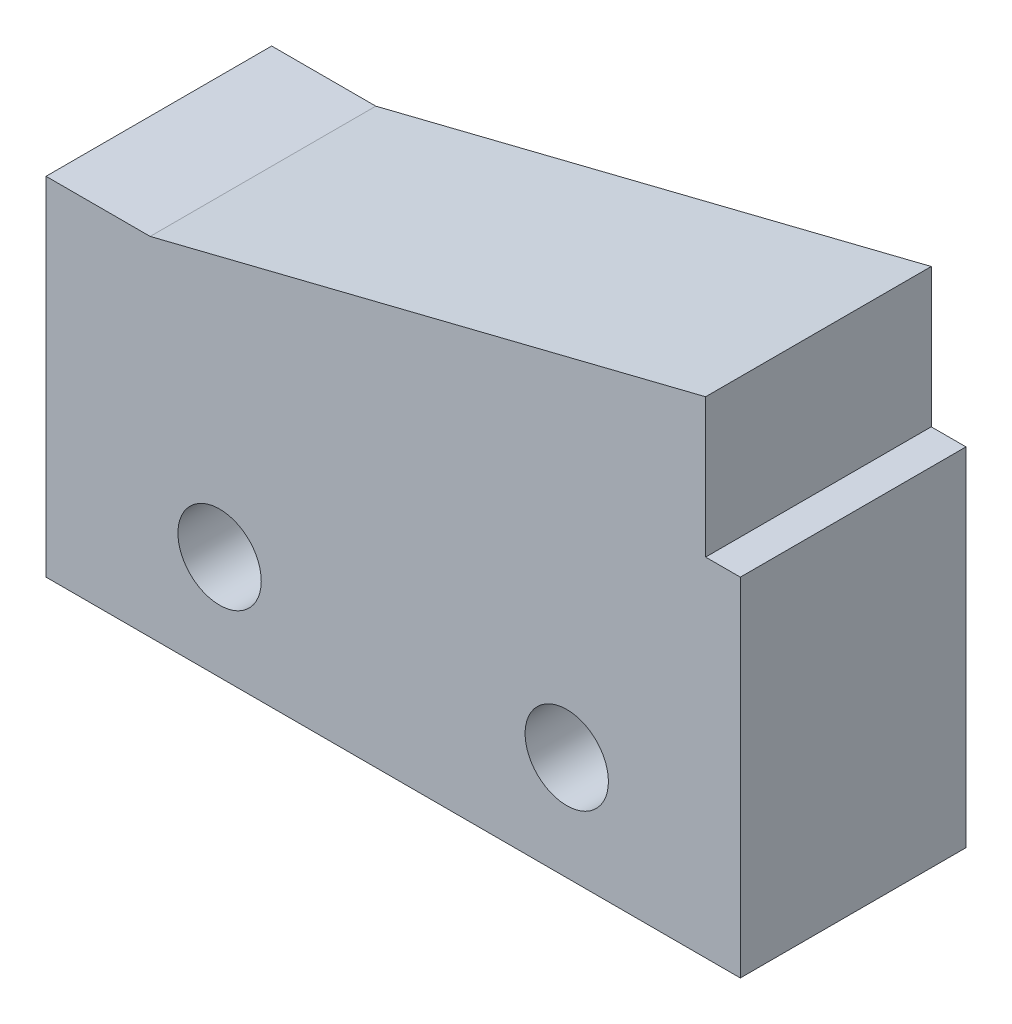
ISO-10303-21;
HEADER;
FILE_DESCRIPTION(('STEP AP214'),'2;1');
FILE_NAME('part.step','',(''),(''),'','','');
FILE_SCHEMA(('AUTOMOTIVE_DESIGN { 1 0 10303 214 1 1 1 1 }'));
ENDSEC;
DATA;
#1=APPLICATION_CONTEXT('core data for automotive mechanical design processes');
#2=APPLICATION_PROTOCOL_DEFINITION('international standard','automotive_design',2000,#1);
#3=PRODUCT_CONTEXT('',#1,'mechanical');
#4=PRODUCT('Part','Part','',(#3));
#5=PRODUCT_RELATED_PRODUCT_CATEGORY('part','',(#4));
#6=PRODUCT_DEFINITION_FORMATION('','',#4);
#7=PRODUCT_DEFINITION_CONTEXT('part definition',#1,'design');
#8=PRODUCT_DEFINITION('design','',#6,#7);
#9=PRODUCT_DEFINITION_SHAPE('','',#8);
#10=(LENGTH_UNIT() NAMED_UNIT(*) SI_UNIT(.MILLI.,.METRE.));
#11=(NAMED_UNIT(*) PLANE_ANGLE_UNIT() SI_UNIT($,.RADIAN.));
#12=(NAMED_UNIT(*) SI_UNIT($,.STERADIAN.) SOLID_ANGLE_UNIT());
#13=UNCERTAINTY_MEASURE_WITH_UNIT(LENGTH_MEASURE(1.E-05),#10,'distance_accuracy_value','');
#14=(GEOMETRIC_REPRESENTATION_CONTEXT(3) GLOBAL_UNCERTAINTY_ASSIGNED_CONTEXT((#13)) GLOBAL_UNIT_ASSIGNED_CONTEXT((#10,
#11,#12)) REPRESENTATION_CONTEXT('',''));
#15=CARTESIAN_POINT('',(0.,0.,0.));
#16=DIRECTION('',(0.,0.,1.));
#17=DIRECTION('',(1.,0.,0.));
#18=AXIS2_PLACEMENT_3D('',#15,#16,#17);
#19=CARTESIAN_POINT('',(19.,0.,6.5));
#20=DIRECTION('',(1.,0.,0.));
#21=DIRECTION('',(0.,0.,-1.));
#22=AXIS2_PLACEMENT_3D('',#19,#20,#21);
#23=PLANE('',#22);
#24=DIRECTION('',(0.,-1.,0.));
#25=VECTOR('',#24,1.);
#26=CARTESIAN_POINT('',(19.,0.,0.));
#27=LINE('',#26,#25);
#28=CARTESIAN_POINT('',(19.,14.,0.));
#29=VERTEX_POINT('',#28);
#30=CARTESIAN_POINT('',(19.,10.,0.));
#31=VERTEX_POINT('',#30);
#32=EDGE_CURVE('E122',#29,#31,#27,.T.);
#33=ORIENTED_EDGE('',*,*,#32,.F.);
#34=DIRECTION('',(0.,0.,-1.));
#35=VECTOR('',#34,1.);
#36=CARTESIAN_POINT('',(19.,14.,6.5));
#37=LINE('',#36,#35);
#38=CARTESIAN_POINT('',(19.,14.,6.5));
#39=VERTEX_POINT('',#38);
#40=EDGE_CURVE('E11',#39,#29,#37,.T.);
#41=ORIENTED_EDGE('',*,*,#40,.F.);
#42=DIRECTION('',(0.,-1.,0.));
#43=VECTOR('',#42,1.);
#44=CARTESIAN_POINT('',(19.,0.,6.5));
#45=LINE('',#44,#43);
#46=CARTESIAN_POINT('',(19.,10.,6.5));
#47=VERTEX_POINT('',#46);
#48=EDGE_CURVE('E157',#39,#47,#45,.T.);
#49=ORIENTED_EDGE('',*,*,#48,.T.);
#50=DIRECTION('',(0.,0.,-1.));
#51=VECTOR('',#50,1.);
#52=CARTESIAN_POINT('',(19.,10.,6.5));
#53=LINE('',#52,#51);
#54=EDGE_CURVE('E50',#47,#31,#53,.T.);
#55=ORIENTED_EDGE('',*,*,#54,.T.);
#56=EDGE_LOOP('',(#33,#41,#49,#55));
#57=FACE_BOUND('',#56,.T.);
#58=ADVANCED_FACE('F34',(#57),#23,.T.);
#59=CARTESIAN_POINT('',(-2.17647058823529,8.70588235294118,6.5));
#60=DIRECTION('',(-0.242535625036333,0.970142500145332,0.));
#61=DIRECTION('',(-0.970142500145332,-0.242535625036333,0.));
#62=AXIS2_PLACEMENT_3D('',#59,#60,#61);
#63=PLANE('',#62);
#64=DIRECTION('',(0.970142500145332,0.242535625036333,0.));
#65=VECTOR('',#64,1.);
#66=CARTESIAN_POINT('',(-2.17647058823529,8.70588235294118,0.));
#67=LINE('',#66,#65);
#68=CARTESIAN_POINT('',(3.,10.,0.));
#69=VERTEX_POINT('',#68);
#70=EDGE_CURVE('E124',#69,#29,#67,.T.);
#71=ORIENTED_EDGE('',*,*,#70,.F.);
#72=DIRECTION('',(0.,0.,-1.));
#73=VECTOR('',#72,1.);
#74=CARTESIAN_POINT('',(3.,10.,6.5));
#75=LINE('',#74,#73);
#76=CARTESIAN_POINT('',(3.,10.,6.5));
#77=VERTEX_POINT('',#76);
#78=EDGE_CURVE('E42',#77,#69,#75,.T.);
#79=ORIENTED_EDGE('',*,*,#78,.F.);
#80=DIRECTION('',(0.970142500145332,0.242535625036333,0.));
#81=VECTOR('',#80,1.);
#82=CARTESIAN_POINT('',(-2.17647058823529,8.70588235294118,6.5));
#83=LINE('',#82,#81);
#84=EDGE_CURVE('E156',#77,#39,#83,.T.);
#85=ORIENTED_EDGE('',*,*,#84,.T.);
#86=ORIENTED_EDGE('',*,*,#40,.T.);
#87=EDGE_LOOP('',(#71,#79,#85,#86));
#88=FACE_BOUND('',#87,.T.);
#89=ADVANCED_FACE('F150',(#88),#63,.T.);
#90=CARTESIAN_POINT('',(0.,10.,6.5));
#91=DIRECTION('',(0.,1.,0.));
#92=DIRECTION('',(0.,0.,1.));
#93=AXIS2_PLACEMENT_3D('',#90,#91,#92);
#94=PLANE('',#93);
#95=DIRECTION('',(1.,0.,0.));
#96=VECTOR('',#95,1.);
#97=CARTESIAN_POINT('',(0.,10.,0.));
#98=LINE('',#97,#96);
#99=CARTESIAN_POINT('',(0.,10.,0.));
#100=VERTEX_POINT('',#99);
#101=EDGE_CURVE('E128',#100,#69,#98,.T.);
#102=ORIENTED_EDGE('',*,*,#101,.F.);
#103=DIRECTION('',(0.,0.,-1.));
#104=VECTOR('',#103,1.);
#105=CARTESIAN_POINT('',(0.,10.,6.5));
#106=LINE('',#105,#104);
#107=CARTESIAN_POINT('',(0.,10.,6.5));
#108=VERTEX_POINT('',#107);
#109=EDGE_CURVE('E141',#108,#100,#106,.T.);
#110=ORIENTED_EDGE('',*,*,#109,.F.);
#111=DIRECTION('',(1.,0.,0.));
#112=VECTOR('',#111,1.);
#113=CARTESIAN_POINT('',(0.,10.,6.5));
#114=LINE('',#113,#112);
#115=EDGE_CURVE('E119',#108,#77,#114,.T.);
#116=ORIENTED_EDGE('',*,*,#115,.T.);
#117=ORIENTED_EDGE('',*,*,#78,.T.);
#118=EDGE_LOOP('',(#102,#110,#116,#117));
#119=FACE_BOUND('',#118,.T.);
#120=ADVANCED_FACE('F146',(#119),#94,.T.);
#121=CARTESIAN_POINT('',(0.,0.,6.5));
#122=DIRECTION('',(-1.,0.,0.));
#123=DIRECTION('',(0.,-1.,0.));
#124=AXIS2_PLACEMENT_3D('',#121,#122,#123);
#125=PLANE('',#124);
#126=DIRECTION('',(0.,1.,0.));
#127=VECTOR('',#126,1.);
#128=CARTESIAN_POINT('',(0.,0.,0.));
#129=LINE('',#128,#127);
#130=CARTESIAN_POINT('',(0.,0.,0.));
#131=VERTEX_POINT('',#130);
#132=EDGE_CURVE('E131',#131,#100,#129,.T.);
#133=ORIENTED_EDGE('',*,*,#132,.F.);
#134=DIRECTION('',(0.,0.,-1.));
#135=VECTOR('',#134,1.);
#136=CARTESIAN_POINT('',(0.,0.,6.5));
#137=LINE('',#136,#135);
#138=CARTESIAN_POINT('',(0.,0.,6.5));
#139=VERTEX_POINT('',#138);
#140=EDGE_CURVE('E113',#139,#131,#137,.T.);
#141=ORIENTED_EDGE('',*,*,#140,.F.);
#142=DIRECTION('',(0.,1.,0.));
#143=VECTOR('',#142,1.);
#144=CARTESIAN_POINT('',(0.,0.,6.5));
#145=LINE('',#144,#143);
#146=EDGE_CURVE('E103',#139,#108,#145,.T.);
#147=ORIENTED_EDGE('',*,*,#146,.T.);
#148=ORIENTED_EDGE('',*,*,#109,.T.);
#149=EDGE_LOOP('',(#133,#141,#147,#148));
#150=FACE_BOUND('',#149,.T.);
#151=ADVANCED_FACE('F155',(#150),#125,.T.);
#152=CARTESIAN_POINT('',(0.,0.,6.5));
#153=DIRECTION('',(0.,1.,0.));
#154=DIRECTION('',(0.,0.,1.));
#155=AXIS2_PLACEMENT_3D('',#152,#153,#154);
#156=PLANE('',#155);
#157=DIRECTION('',(1.,0.,0.));
#158=VECTOR('',#157,1.);
#159=CARTESIAN_POINT('',(0.,0.,0.));
#160=LINE('',#159,#158);
#161=CARTESIAN_POINT('',(20.,0.,0.));
#162=VERTEX_POINT('',#161);
#163=EDGE_CURVE('E110',#131,#162,#160,.T.);
#164=ORIENTED_EDGE('',*,*,#163,.T.);
#165=DIRECTION('',(0.,0.,-1.));
#166=VECTOR('',#165,1.);
#167=CARTESIAN_POINT('',(20.,0.,6.5));
#168=LINE('',#167,#166);
#169=CARTESIAN_POINT('',(20.,0.,6.5));
#170=VERTEX_POINT('',#169);
#171=EDGE_CURVE('E107',#170,#162,#168,.T.);
#172=ORIENTED_EDGE('',*,*,#171,.F.);
#173=DIRECTION('',(1.,0.,0.));
#174=VECTOR('',#173,1.);
#175=CARTESIAN_POINT('',(0.,0.,6.5));
#176=LINE('',#175,#174);
#177=EDGE_CURVE('E95',#139,#170,#176,.T.);
#178=ORIENTED_EDGE('',*,*,#177,.F.);
#179=ORIENTED_EDGE('',*,*,#140,.T.);
#180=EDGE_LOOP('',(#164,#172,#178,#179));
#181=FACE_BOUND('',#180,.T.);
#182=ADVANCED_FACE('F108',(#181),#156,.F.);
#183=CARTESIAN_POINT('',(20.,0.,6.5));
#184=DIRECTION('',(-1.,0.,0.));
#185=DIRECTION('',(0.,-1.,0.));
#186=AXIS2_PLACEMENT_3D('',#183,#184,#185);
#187=PLANE('',#186);
#188=DIRECTION('',(0.,1.,0.));
#189=VECTOR('',#188,1.);
#190=CARTESIAN_POINT('',(20.,0.,0.));
#191=LINE('',#190,#189);
#192=CARTESIAN_POINT('',(20.,10.,0.));
#193=VERTEX_POINT('',#192);
#194=EDGE_CURVE('E136',#162,#193,#191,.T.);
#195=ORIENTED_EDGE('',*,*,#194,.T.);
#196=DIRECTION('',(0.,0.,-1.));
#197=VECTOR('',#196,1.);
#198=CARTESIAN_POINT('',(20.,10.,6.5));
#199=LINE('',#198,#197);
#200=CARTESIAN_POINT('',(20.,10.,6.5));
#201=VERTEX_POINT('',#200);
#202=EDGE_CURVE('E73',#201,#193,#199,.T.);
#203=ORIENTED_EDGE('',*,*,#202,.F.);
#204=DIRECTION('',(0.,1.,0.));
#205=VECTOR('',#204,1.);
#206=CARTESIAN_POINT('',(20.,0.,6.5));
#207=LINE('',#206,#205);
#208=EDGE_CURVE('E100',#170,#201,#207,.T.);
#209=ORIENTED_EDGE('',*,*,#208,.F.);
#210=ORIENTED_EDGE('',*,*,#171,.T.);
#211=EDGE_LOOP('',(#195,#203,#209,#210));
#212=FACE_BOUND('',#211,.T.);
#213=ADVANCED_FACE('F115',(#212),#187,.F.);
#214=EDGE_CURVE('E132',#31,#193,#98,.T.);
#215=ORIENTED_EDGE('',*,*,#214,.F.);
#216=ORIENTED_EDGE('',*,*,#54,.F.);
#217=EDGE_CURVE('E116',#47,#201,#114,.T.);
#218=ORIENTED_EDGE('',*,*,#217,.T.);
#219=ORIENTED_EDGE('',*,*,#202,.T.);
#220=EDGE_LOOP('',(#215,#216,#218,#219));
#221=FACE_BOUND('',#220,.T.);
#222=ADVANCED_FACE('F177',(#221),#94,.T.);
#223=CARTESIAN_POINT('',(0.,0.,6.5));
#224=DIRECTION('',(0.,0.,1.));
#225=DIRECTION('',(1.,0.,0.));
#226=AXIS2_PLACEMENT_3D('',#223,#224,#225);
#227=PLANE('',#226);
#228=CARTESIAN_POINT('',(5.,3.,6.5));
#229=DIRECTION('',(0.,0.,1.));
#230=DIRECTION('',(1.,0.,0.));
#231=AXIS2_PLACEMENT_3D('',#228,#229,#230);
#232=CIRCLE('',#231,1.2);
#233=CARTESIAN_POINT('',(6.2,3.,6.5));
#234=VERTEX_POINT('',#233);
#235=EDGE_CURVE('E169',#234,#234,#232,.T.);
#236=ORIENTED_EDGE('',*,*,#235,.F.);
#237=EDGE_LOOP('',(#236));
#238=FACE_BOUND('',#237,.T.);
#239=CARTESIAN_POINT('',(15.,3.,6.5));
#240=DIRECTION('',(0.,0.,1.));
#241=DIRECTION('',(1.,0.,0.));
#242=AXIS2_PLACEMENT_3D('',#239,#240,#241);
#243=CIRCLE('',#242,1.2);
#244=CARTESIAN_POINT('',(16.2,3.,6.5));
#245=VERTEX_POINT('',#244);
#246=EDGE_CURVE('E163',#245,#245,#243,.T.);
#247=ORIENTED_EDGE('',*,*,#246,.F.);
#248=EDGE_LOOP('',(#247));
#249=FACE_BOUND('',#248,.T.);
#250=ORIENTED_EDGE('',*,*,#48,.F.);
#251=ORIENTED_EDGE('',*,*,#84,.F.);
#252=ORIENTED_EDGE('',*,*,#115,.F.);
#253=ORIENTED_EDGE('',*,*,#146,.F.);
#254=ORIENTED_EDGE('',*,*,#177,.T.);
#255=ORIENTED_EDGE('',*,*,#208,.T.);
#256=ORIENTED_EDGE('',*,*,#217,.F.);
#257=EDGE_LOOP('',(#250,#251,#252,#253,#254,#255,#256));
#258=FACE_BOUND('',#257,.T.);
#259=ADVANCED_FACE('F97',(#238,#249,#258),#227,.T.);
#260=CARTESIAN_POINT('',(0.,0.,0.));
#261=DIRECTION('',(0.,0.,1.));
#262=DIRECTION('',(1.,0.,0.));
#263=AXIS2_PLACEMENT_3D('',#260,#261,#262);
#264=PLANE('',#263);
#265=CARTESIAN_POINT('',(5.,3.,0.));
#266=DIRECTION('',(0.,0.,1.));
#267=DIRECTION('',(1.,0.,0.));
#268=AXIS2_PLACEMENT_3D('',#265,#266,#267);
#269=CIRCLE('',#268,1.2);
#270=CARTESIAN_POINT('',(6.2,3.,0.));
#271=VERTEX_POINT('',#270);
#272=EDGE_CURVE('E166',#271,#271,#269,.T.);
#273=ORIENTED_EDGE('',*,*,#272,.T.);
#274=EDGE_LOOP('',(#273));
#275=FACE_BOUND('',#274,.T.);
#276=CARTESIAN_POINT('',(15.,3.,0.));
#277=DIRECTION('',(0.,0.,1.));
#278=DIRECTION('',(1.,0.,0.));
#279=AXIS2_PLACEMENT_3D('',#276,#277,#278);
#280=CIRCLE('',#279,1.2);
#281=CARTESIAN_POINT('',(16.2,3.,0.));
#282=VERTEX_POINT('',#281);
#283=EDGE_CURVE('E125',#282,#282,#280,.T.);
#284=ORIENTED_EDGE('',*,*,#283,.T.);
#285=EDGE_LOOP('',(#284));
#286=FACE_BOUND('',#285,.T.);
#287=ORIENTED_EDGE('',*,*,#32,.T.);
#288=ORIENTED_EDGE('',*,*,#214,.T.);
#289=ORIENTED_EDGE('',*,*,#194,.F.);
#290=ORIENTED_EDGE('',*,*,#163,.F.);
#291=ORIENTED_EDGE('',*,*,#132,.T.);
#292=ORIENTED_EDGE('',*,*,#101,.T.);
#293=ORIENTED_EDGE('',*,*,#70,.T.);
#294=EDGE_LOOP('',(#287,#288,#289,#290,#291,#292,#293));
#295=FACE_BOUND('',#294,.T.);
#296=ADVANCED_FACE('F152',(#275,#286,#295),#264,.F.);
#297=CARTESIAN_POINT('',(15.,3.,6.5));
#298=DIRECTION('',(0.,0.,1.));
#299=DIRECTION('',(1.,0.,0.));
#300=AXIS2_PLACEMENT_3D('',#297,#298,#299);
#301=CYLINDRICAL_SURFACE('',#300,1.2);
#302=ORIENTED_EDGE('',*,*,#283,.F.);
#303=EDGE_LOOP('',(#302));
#304=FACE_BOUND('',#303,.T.);
#305=ORIENTED_EDGE('',*,*,#246,.T.);
#306=EDGE_LOOP('',(#305));
#307=FACE_BOUND('',#306,.T.);
#308=ADVANCED_FACE('F181',(#304,#307),#301,.F.);
#309=CARTESIAN_POINT('',(5.,3.,6.5));
#310=DIRECTION('',(0.,0.,1.));
#311=DIRECTION('',(1.,0.,0.));
#312=AXIS2_PLACEMENT_3D('',#309,#310,#311);
#313=CYLINDRICAL_SURFACE('',#312,1.2);
#314=ORIENTED_EDGE('',*,*,#272,.F.);
#315=EDGE_LOOP('',(#314));
#316=FACE_BOUND('',#315,.T.);
#317=ORIENTED_EDGE('',*,*,#235,.T.);
#318=EDGE_LOOP('',(#317));
#319=FACE_BOUND('',#318,.T.);
#320=ADVANCED_FACE('F173',(#316,#319),#313,.F.);
#321=CLOSED_SHELL('',(#58,#89,#120,#151,#182,#213,#222,#259,#296,#308,#320));
#322=MANIFOLD_SOLID_BREP('B2',#321);
#323=ADVANCED_BREP_SHAPE_REPRESENTATION('',(#18,#322),#14);
#324=SHAPE_DEFINITION_REPRESENTATION(#9,#323);
ENDSEC;
END-ISO-10303-21;
